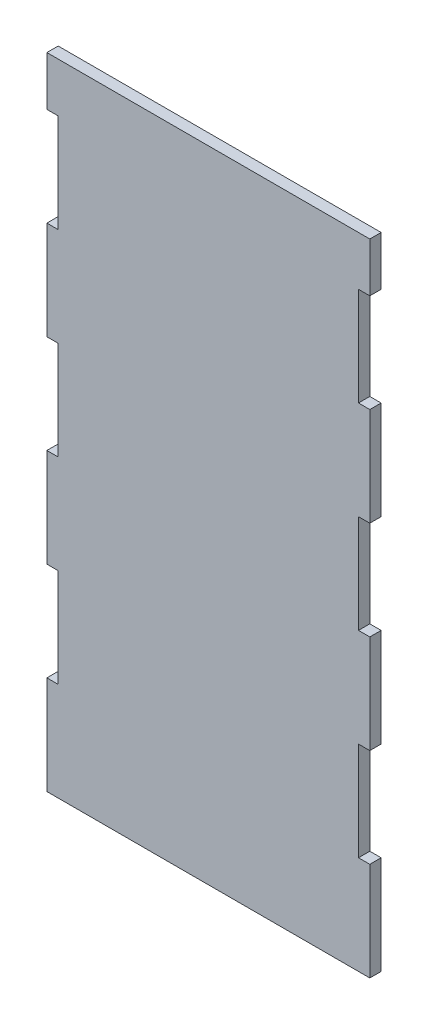
ISO-10303-21;
HEADER;
FILE_DESCRIPTION(('STEP AP214'),'2;1');
FILE_NAME('part.step','',(''),(''),'','','');
FILE_SCHEMA(('AUTOMOTIVE_DESIGN { 1 0 10303 214 1 1 1 1 }'));
ENDSEC;
DATA;
#1=APPLICATION_CONTEXT('core data for automotive mechanical design processes');
#2=APPLICATION_PROTOCOL_DEFINITION('international standard','automotive_design',2000,#1);
#3=PRODUCT_CONTEXT('',#1,'mechanical');
#4=PRODUCT('Part','Part','',(#3));
#5=PRODUCT_RELATED_PRODUCT_CATEGORY('part','',(#4));
#6=PRODUCT_DEFINITION_FORMATION('','',#4);
#7=PRODUCT_DEFINITION_CONTEXT('part definition',#1,'design');
#8=PRODUCT_DEFINITION('design','',#6,#7);
#9=PRODUCT_DEFINITION_SHAPE('','',#8);
#10=(LENGTH_UNIT() NAMED_UNIT(*) SI_UNIT(.MILLI.,.METRE.));
#11=(NAMED_UNIT(*) PLANE_ANGLE_UNIT() SI_UNIT($,.RADIAN.));
#12=(NAMED_UNIT(*) SI_UNIT($,.STERADIAN.) SOLID_ANGLE_UNIT());
#13=UNCERTAINTY_MEASURE_WITH_UNIT(LENGTH_MEASURE(1.E-05),#10,'distance_accuracy_value','');
#14=(GEOMETRIC_REPRESENTATION_CONTEXT(3) GLOBAL_UNCERTAINTY_ASSIGNED_CONTEXT((#13)) GLOBAL_UNIT_ASSIGNED_CONTEXT((#10,
#11,#12)) REPRESENTATION_CONTEXT('',''));
#15=CARTESIAN_POINT('',(0.,0.,0.));
#16=DIRECTION('',(0.,0.,1.));
#17=DIRECTION('',(1.,0.,0.));
#18=AXIS2_PLACEMENT_3D('',#15,#16,#17);
#19=CARTESIAN_POINT('',(-41.656,82.55,1.4605));
#20=DIRECTION('',(1.,0.,0.));
#21=DIRECTION('',(0.,1.,0.));
#22=AXIS2_PLACEMENT_3D('',#19,#20,#21);
#23=PLANE('',#22);
#24=DIRECTION('',(0.,0.,1.));
#25=VECTOR('',#24,1.);
#26=CARTESIAN_POINT('',(-41.656,-31.75,-1.4605));
#27=LINE('',#26,#25);
#28=CARTESIAN_POINT('',(-41.656,-31.75,-1.4605));
#29=VERTEX_POINT('',#28);
#30=CARTESIAN_POINT('',(-41.656,-31.75,1.4605));
#31=VERTEX_POINT('',#30);
#32=EDGE_CURVE('E563',#29,#31,#27,.T.);
#33=ORIENTED_EDGE('',*,*,#32,.T.);
#34=DIRECTION('',(0.,-1.,0.));
#35=VECTOR('',#34,1.);
#36=CARTESIAN_POINT('',(-41.656,82.55,1.4605));
#37=LINE('',#36,#35);
#38=CARTESIAN_POINT('',(-41.656,-6.35,1.4605));
#39=VERTEX_POINT('',#38);
#40=EDGE_CURVE('E515',#39,#31,#37,.T.);
#41=ORIENTED_EDGE('',*,*,#40,.F.);
#42=DIRECTION('',(0.,0.,1.));
#43=VECTOR('',#42,1.);
#44=CARTESIAN_POINT('',(-41.656,-6.35,-1.4605));
#45=LINE('',#44,#43);
#46=CARTESIAN_POINT('',(-41.656,-6.35,-1.4605));
#47=VERTEX_POINT('',#46);
#48=EDGE_CURVE('E245',#47,#39,#45,.T.);
#49=ORIENTED_EDGE('',*,*,#48,.F.);
#50=DIRECTION('',(0.,-1.,0.));
#51=VECTOR('',#50,1.);
#52=CARTESIAN_POINT('',(-41.656,82.55,-1.4605));
#53=LINE('',#52,#51);
#54=EDGE_CURVE('E266',#47,#29,#53,.T.);
#55=ORIENTED_EDGE('',*,*,#54,.T.);
#56=EDGE_LOOP('',(#33,#41,#49,#55));
#57=FACE_BOUND('',#56,.T.);
#58=ADVANCED_FACE('F47',(#57),#23,.F.);
#59=DIRECTION('',(0.,0.,1.));
#60=VECTOR('',#59,1.);
#61=CARTESIAN_POINT('',(-41.656,19.05,-1.4605));
#62=LINE('',#61,#60);
#63=CARTESIAN_POINT('',(-41.656,19.05,-1.4605));
#64=VERTEX_POINT('',#63);
#65=CARTESIAN_POINT('',(-41.656,19.05,1.4605));
#66=VERTEX_POINT('',#65);
#67=EDGE_CURVE('E232',#64,#66,#62,.T.);
#68=ORIENTED_EDGE('',*,*,#67,.T.);
#69=CARTESIAN_POINT('',(-41.656,44.45,1.4605));
#70=VERTEX_POINT('',#69);
#71=EDGE_CURVE('E457',#70,#66,#37,.T.);
#72=ORIENTED_EDGE('',*,*,#71,.F.);
#73=DIRECTION('',(0.,0.,1.));
#74=VECTOR('',#73,1.);
#75=CARTESIAN_POINT('',(-41.656,44.45,-1.4605));
#76=LINE('',#75,#74);
#77=CARTESIAN_POINT('',(-41.656,44.45,-1.4605));
#78=VERTEX_POINT('',#77);
#79=EDGE_CURVE('E263',#78,#70,#76,.T.);
#80=ORIENTED_EDGE('',*,*,#79,.F.);
#81=EDGE_CURVE('E254',#78,#64,#53,.T.);
#82=ORIENTED_EDGE('',*,*,#81,.T.);
#83=EDGE_LOOP('',(#68,#72,#80,#82));
#84=FACE_BOUND('',#83,.T.);
#85=ADVANCED_FACE('F262',(#84),#23,.F.);
#86=DIRECTION('',(0.,0.,1.));
#87=VECTOR('',#86,1.);
#88=CARTESIAN_POINT('',(-41.656,69.85,-1.4605));
#89=LINE('',#88,#87);
#90=CARTESIAN_POINT('',(-41.656,69.85,-1.4605));
#91=VERTEX_POINT('',#90);
#92=CARTESIAN_POINT('',(-41.656,69.85,1.4605));
#93=VERTEX_POINT('',#92);
#94=EDGE_CURVE('E427',#91,#93,#89,.T.);
#95=ORIENTED_EDGE('',*,*,#94,.T.);
#96=CARTESIAN_POINT('',(-41.656,82.55,1.4605));
#97=VERTEX_POINT('',#96);
#98=EDGE_CURVE('E452',#97,#93,#37,.T.);
#99=ORIENTED_EDGE('',*,*,#98,.F.);
#100=DIRECTION('',(0.,0.,-1.));
#101=VECTOR('',#100,1.);
#102=CARTESIAN_POINT('',(-41.656,82.55,1.4605));
#103=LINE('',#102,#101);
#104=CARTESIAN_POINT('',(-41.656,82.55,-1.4605));
#105=VERTEX_POINT('',#104);
#106=EDGE_CURVE('E290',#97,#105,#103,.T.);
#107=ORIENTED_EDGE('',*,*,#106,.T.);
#108=EDGE_CURVE('E265',#105,#91,#53,.T.);
#109=ORIENTED_EDGE('',*,*,#108,.T.);
#110=EDGE_LOOP('',(#95,#99,#107,#109));
#111=FACE_BOUND('',#110,.T.);
#112=ADVANCED_FACE('F503',(#111),#23,.F.);
#113=CARTESIAN_POINT('',(41.656,82.55,1.4605));
#114=DIRECTION('',(-1.,0.,0.));
#115=DIRECTION('',(0.,0.,1.));
#116=AXIS2_PLACEMENT_3D('',#113,#114,#115);
#117=PLANE('',#116);
#118=DIRECTION('',(0.,0.,1.));
#119=VECTOR('',#118,1.);
#120=CARTESIAN_POINT('',(41.656,69.85,-1.4605));
#121=LINE('',#120,#119);
#122=CARTESIAN_POINT('',(41.656,69.85,-1.4605));
#123=VERTEX_POINT('',#122);
#124=CARTESIAN_POINT('',(41.656,69.85,1.4605));
#125=VERTEX_POINT('',#124);
#126=EDGE_CURVE('E367',#123,#125,#121,.T.);
#127=ORIENTED_EDGE('',*,*,#126,.F.);
#128=DIRECTION('',(0.,1.,0.));
#129=VECTOR('',#128,1.);
#130=CARTESIAN_POINT('',(41.656,82.55,-1.4605));
#131=LINE('',#130,#129);
#132=CARTESIAN_POINT('',(41.656,82.55,-1.4605));
#133=VERTEX_POINT('',#132);
#134=EDGE_CURVE('E280',#123,#133,#131,.T.);
#135=ORIENTED_EDGE('',*,*,#134,.T.);
#136=DIRECTION('',(0.,0.,-1.));
#137=VECTOR('',#136,1.);
#138=CARTESIAN_POINT('',(41.656,82.55,1.4605));
#139=LINE('',#138,#137);
#140=CARTESIAN_POINT('',(41.656,82.55,1.4605));
#141=VERTEX_POINT('',#140);
#142=EDGE_CURVE('E294',#141,#133,#139,.T.);
#143=ORIENTED_EDGE('',*,*,#142,.F.);
#144=DIRECTION('',(0.,1.,0.));
#145=VECTOR('',#144,1.);
#146=CARTESIAN_POINT('',(41.656,82.55,1.4605));
#147=LINE('',#146,#145);
#148=EDGE_CURVE('E459',#125,#141,#147,.T.);
#149=ORIENTED_EDGE('',*,*,#148,.F.);
#150=EDGE_LOOP('',(#127,#135,#143,#149));
#151=FACE_BOUND('',#150,.T.);
#152=ADVANCED_FACE('F495',(#151),#117,.F.);
#153=CARTESIAN_POINT('',(41.656,19.05,-1.4605));
#154=VERTEX_POINT('',#153);
#155=CARTESIAN_POINT('',(41.656,44.45,-1.4605));
#156=VERTEX_POINT('',#155);
#157=EDGE_CURVE('E484',#154,#156,#131,.T.);
#158=ORIENTED_EDGE('',*,*,#157,.T.);
#159=DIRECTION('',(0.,0.,1.));
#160=VECTOR('',#159,1.);
#161=CARTESIAN_POINT('',(41.656,44.45,-1.4605));
#162=LINE('',#161,#160);
#163=CARTESIAN_POINT('',(41.656,44.45,1.4605));
#164=VERTEX_POINT('',#163);
#165=EDGE_CURVE('E407',#156,#164,#162,.T.);
#166=ORIENTED_EDGE('',*,*,#165,.T.);
#167=CARTESIAN_POINT('',(41.656,19.05,1.4605));
#168=VERTEX_POINT('',#167);
#169=EDGE_CURVE('E467',#168,#164,#147,.T.);
#170=ORIENTED_EDGE('',*,*,#169,.F.);
#171=DIRECTION('',(0.,0.,1.));
#172=VECTOR('',#171,1.);
#173=CARTESIAN_POINT('',(41.656,19.05,-1.4605));
#174=LINE('',#173,#172);
#175=EDGE_CURVE('E335',#154,#168,#174,.T.);
#176=ORIENTED_EDGE('',*,*,#175,.F.);
#177=EDGE_LOOP('',(#158,#166,#170,#176));
#178=FACE_BOUND('',#177,.T.);
#179=ADVANCED_FACE('F482',(#178),#117,.F.);
#180=CARTESIAN_POINT('',(41.656,-31.75,-1.4605));
#181=VERTEX_POINT('',#180);
#182=CARTESIAN_POINT('',(41.656,-6.35000000000001,-1.4605));
#183=VERTEX_POINT('',#182);
#184=EDGE_CURVE('E286',#181,#183,#131,.T.);
#185=ORIENTED_EDGE('',*,*,#184,.T.);
#186=DIRECTION('',(0.,0.,1.));
#187=VECTOR('',#186,1.);
#188=CARTESIAN_POINT('',(41.656,-6.35000000000001,-1.4605));
#189=LINE('',#188,#187);
#190=CARTESIAN_POINT('',(41.656,-6.35000000000001,1.4605));
#191=VERTEX_POINT('',#190);
#192=EDGE_CURVE('E375',#183,#191,#189,.T.);
#193=ORIENTED_EDGE('',*,*,#192,.T.);
#194=CARTESIAN_POINT('',(41.656,-31.75,1.4605));
#195=VERTEX_POINT('',#194);
#196=EDGE_CURVE('E461',#195,#191,#147,.T.);
#197=ORIENTED_EDGE('',*,*,#196,.F.);
#198=DIRECTION('',(0.,0.,1.));
#199=VECTOR('',#198,1.);
#200=CARTESIAN_POINT('',(41.656,-31.75,-1.4605));
#201=LINE('',#200,#199);
#202=EDGE_CURVE('E342',#181,#195,#201,.T.);
#203=ORIENTED_EDGE('',*,*,#202,.F.);
#204=EDGE_LOOP('',(#185,#193,#197,#203));
#205=FACE_BOUND('',#204,.T.);
#206=ADVANCED_FACE('F593',(#205),#117,.F.);
#207=CARTESIAN_POINT('',(0.,0.,1.4605));
#208=DIRECTION('',(0.,0.,1.));
#209=DIRECTION('',(1.,0.,0.));
#210=AXIS2_PLACEMENT_3D('',#207,#208,#209);
#211=PLANE('',#210);
#212=DIRECTION('',(0.,-1.,0.));
#213=VECTOR('',#212,1.);
#214=CARTESIAN_POINT('',(38.735,0.,1.4605));
#215=LINE('',#214,#213);
#216=CARTESIAN_POINT('',(38.735,69.85,1.4605));
#217=VERTEX_POINT('',#216);
#218=CARTESIAN_POINT('',(38.735,44.45,1.4605));
#219=VERTEX_POINT('',#218);
#220=EDGE_CURVE('E399',#217,#219,#215,.T.);
#221=ORIENTED_EDGE('',*,*,#220,.F.);
#222=DIRECTION('',(1.,0.,0.));
#223=VECTOR('',#222,1.);
#224=CARTESIAN_POINT('',(0.,69.85,1.4605));
#225=LINE('',#224,#223);
#226=EDGE_CURVE('E395',#217,#125,#225,.T.);
#227=ORIENTED_EDGE('',*,*,#226,.T.);
#228=ORIENTED_EDGE('',*,*,#148,.T.);
#229=DIRECTION('',(-1.,0.,0.));
#230=VECTOR('',#229,1.);
#231=CARTESIAN_POINT('',(-41.656,82.55,1.4605));
#232=LINE('',#231,#230);
#233=EDGE_CURVE('E276',#141,#97,#232,.T.);
#234=ORIENTED_EDGE('',*,*,#233,.T.);
#235=ORIENTED_EDGE('',*,*,#98,.T.);
#236=DIRECTION('',(1.,0.,0.));
#237=VECTOR('',#236,1.);
#238=CARTESIAN_POINT('',(3.31860143230342E-13,69.8499999999998,1.4605));
#239=LINE('',#238,#237);
#240=CARTESIAN_POINT('',(-38.735,69.85,1.4605));
#241=VERTEX_POINT('',#240);
#242=EDGE_CURVE('E428',#93,#241,#239,.T.);
#243=ORIENTED_EDGE('',*,*,#242,.T.);
#244=DIRECTION('',(0.,-1.,0.));
#245=VECTOR('',#244,1.);
#246=CARTESIAN_POINT('',(-38.735,0.,1.4605));
#247=LINE('',#246,#245);
#248=CARTESIAN_POINT('',(-38.735,44.45,1.4605));
#249=VERTEX_POINT('',#248);
#250=EDGE_CURVE('E420',#241,#249,#247,.T.);
#251=ORIENTED_EDGE('',*,*,#250,.T.);
#252=DIRECTION('',(1.,0.,0.));
#253=VECTOR('',#252,1.);
#254=CARTESIAN_POINT('',(2.11183727510218E-13,44.4499999999998,1.4605));
#255=LINE('',#254,#253);
#256=EDGE_CURVE('E432',#70,#249,#255,.T.);
#257=ORIENTED_EDGE('',*,*,#256,.F.);
#258=ORIENTED_EDGE('',*,*,#71,.T.);
#259=DIRECTION('',(1.,0.,0.));
#260=VECTOR('',#259,1.);
#261=CARTESIAN_POINT('',(0.,19.0499999999998,1.4605));
#262=LINE('',#261,#260);
#263=CARTESIAN_POINT('',(-38.735,19.05,1.4605));
#264=VERTEX_POINT('',#263);
#265=EDGE_CURVE('E239',#66,#264,#262,.T.);
#266=ORIENTED_EDGE('',*,*,#265,.T.);
#267=DIRECTION('',(0.,-1.,0.));
#268=VECTOR('',#267,1.);
#269=CARTESIAN_POINT('',(-38.735,0.,1.4605));
#270=LINE('',#269,#268);
#271=CARTESIAN_POINT('',(-38.735,-6.35,1.4605));
#272=VERTEX_POINT('',#271);
#273=EDGE_CURVE('E259',#264,#272,#270,.T.);
#274=ORIENTED_EDGE('',*,*,#273,.T.);
#275=DIRECTION('',(1.,0.,0.));
#276=VECTOR('',#275,1.);
#277=CARTESIAN_POINT('',(0.,-6.35000000000019,1.4605));
#278=LINE('',#277,#276);
#279=EDGE_CURVE('E548',#39,#272,#278,.T.);
#280=ORIENTED_EDGE('',*,*,#279,.F.);
#281=ORIENTED_EDGE('',*,*,#40,.T.);
#282=DIRECTION('',(1.,0.,0.));
#283=VECTOR('',#282,1.);
#284=CARTESIAN_POINT('',(-1.50845519650157E-13,-31.7500000000002,1.4605));
#285=LINE('',#284,#283);
#286=CARTESIAN_POINT('',(-38.735,-31.75,1.4605));
#287=VERTEX_POINT('',#286);
#288=EDGE_CURVE('E345',#31,#287,#285,.T.);
#289=ORIENTED_EDGE('',*,*,#288,.T.);
#290=DIRECTION('',(0.,-1.,0.));
#291=VECTOR('',#290,1.);
#292=CARTESIAN_POINT('',(-38.735,0.,1.4605));
#293=LINE('',#292,#291);
#294=CARTESIAN_POINT('',(-38.735,-57.15,1.4605));
#295=VERTEX_POINT('',#294);
#296=EDGE_CURVE('E577',#287,#295,#293,.T.);
#297=ORIENTED_EDGE('',*,*,#296,.T.);
#298=DIRECTION('',(1.,0.,0.));
#299=VECTOR('',#298,1.);
#300=CARTESIAN_POINT('',(-1.35760967685141E-13,-57.1500000000001,1.4605));
#301=LINE('',#300,#299);
#302=CARTESIAN_POINT('',(-41.656,-57.15,1.4605));
#303=VERTEX_POINT('',#302);
#304=EDGE_CURVE('E526',#303,#295,#301,.T.);
#305=ORIENTED_EDGE('',*,*,#304,.F.);
#306=CARTESIAN_POINT('',(-41.656,-82.55,1.4605));
#307=VERTEX_POINT('',#306);
#308=EDGE_CURVE('E289',#303,#307,#37,.T.);
#309=ORIENTED_EDGE('',*,*,#308,.T.);
#310=DIRECTION('',(1.,0.,0.));
#311=VECTOR('',#310,1.);
#312=CARTESIAN_POINT('',(-41.656,-82.55,1.4605));
#313=LINE('',#312,#311);
#314=CARTESIAN_POINT('',(41.656,-82.55,1.4605));
#315=VERTEX_POINT('',#314);
#316=EDGE_CURVE('E456',#307,#315,#313,.T.);
#317=ORIENTED_EDGE('',*,*,#316,.T.);
#318=CARTESIAN_POINT('',(41.656,-57.15,1.4605));
#319=VERTEX_POINT('',#318);
#320=EDGE_CURVE('E306',#315,#319,#147,.T.);
#321=ORIENTED_EDGE('',*,*,#320,.T.);
#322=DIRECTION('',(1.,0.,0.));
#323=VECTOR('',#322,1.);
#324=CARTESIAN_POINT('',(0.,-57.15,1.4605));
#325=LINE('',#324,#323);
#326=CARTESIAN_POINT('',(38.735,-57.15,1.4605));
#327=VERTEX_POINT('',#326);
#328=EDGE_CURVE('E339',#327,#319,#325,.T.);
#329=ORIENTED_EDGE('',*,*,#328,.F.);
#330=DIRECTION('',(0.,-1.,0.));
#331=VECTOR('',#330,1.);
#332=CARTESIAN_POINT('',(38.735,0.,1.4605));
#333=LINE('',#332,#331);
#334=CARTESIAN_POINT('',(38.735,-31.75,1.4605));
#335=VERTEX_POINT('',#334);
#336=EDGE_CURVE('E334',#335,#327,#333,.T.);
#337=ORIENTED_EDGE('',*,*,#336,.F.);
#338=DIRECTION('',(1.,0.,0.));
#339=VECTOR('',#338,1.);
#340=CARTESIAN_POINT('',(0.,-31.75,1.4605));
#341=LINE('',#340,#339);
#342=EDGE_CURVE('E330',#335,#195,#341,.T.);
#343=ORIENTED_EDGE('',*,*,#342,.T.);
#344=ORIENTED_EDGE('',*,*,#196,.T.);
#345=DIRECTION('',(1.,0.,0.));
#346=VECTOR('',#345,1.);
#347=CARTESIAN_POINT('',(0.,-6.35000000000001,1.4605));
#348=LINE('',#347,#346);
#349=CARTESIAN_POINT('',(38.735,-6.35000000000001,1.4605));
#350=VERTEX_POINT('',#349);
#351=EDGE_CURVE('E355',#350,#191,#348,.T.);
#352=ORIENTED_EDGE('',*,*,#351,.F.);
#353=DIRECTION('',(0.,-1.,0.));
#354=VECTOR('',#353,1.);
#355=CARTESIAN_POINT('',(38.735,0.,1.4605));
#356=LINE('',#355,#354);
#357=CARTESIAN_POINT('',(38.735,19.05,1.4605));
#358=VERTEX_POINT('',#357);
#359=EDGE_CURVE('E366',#358,#350,#356,.T.);
#360=ORIENTED_EDGE('',*,*,#359,.F.);
#361=DIRECTION('',(1.,0.,0.));
#362=VECTOR('',#361,1.);
#363=CARTESIAN_POINT('',(0.,19.05,1.4605));
#364=LINE('',#363,#362);
#365=EDGE_CURVE('E362',#358,#168,#364,.T.);
#366=ORIENTED_EDGE('',*,*,#365,.T.);
#367=ORIENTED_EDGE('',*,*,#169,.T.);
#368=DIRECTION('',(1.,0.,0.));
#369=VECTOR('',#368,1.);
#370=CARTESIAN_POINT('',(0.,44.45,1.4605));
#371=LINE('',#370,#369);
#372=EDGE_CURVE('E388',#219,#164,#371,.T.);
#373=ORIENTED_EDGE('',*,*,#372,.F.);
#374=EDGE_LOOP('',(#221,#227,#228,#234,#235,#243,#251,#257,#258,#266,#274,#280,#281,#289,#297,
#305,#309,#317,#321,#329,#337,#343,#344,#352,#360,#366,#367,#373));
#375=FACE_BOUND('',#374,.T.);
#376=ADVANCED_FACE('F476',(#375),#211,.T.);
#377=CARTESIAN_POINT('',(0.,0.,-1.4605));
#378=DIRECTION('',(0.,0.,1.));
#379=DIRECTION('',(1.,0.,0.));
#380=AXIS2_PLACEMENT_3D('',#377,#378,#379);
#381=PLANE('',#380);
#382=DIRECTION('',(1.,0.,0.));
#383=VECTOR('',#382,1.);
#384=CARTESIAN_POINT('',(0.,69.85,-1.4605));
#385=LINE('',#384,#383);
#386=CARTESIAN_POINT('',(38.735,69.85,-1.4605));
#387=VERTEX_POINT('',#386);
#388=EDGE_CURVE('E384',#387,#123,#385,.T.);
#389=ORIENTED_EDGE('',*,*,#388,.F.);
#390=DIRECTION('',(0.,-1.,0.));
#391=VECTOR('',#390,1.);
#392=CARTESIAN_POINT('',(38.735,0.,-1.4605));
#393=LINE('',#392,#391);
#394=CARTESIAN_POINT('',(38.735,44.45,-1.4605));
#395=VERTEX_POINT('',#394);
#396=EDGE_CURVE('E387',#387,#395,#393,.T.);
#397=ORIENTED_EDGE('',*,*,#396,.T.);
#398=DIRECTION('',(1.,0.,0.));
#399=VECTOR('',#398,1.);
#400=CARTESIAN_POINT('',(0.,44.45,-1.4605));
#401=LINE('',#400,#399);
#402=EDGE_CURVE('E63',#395,#156,#401,.T.);
#403=ORIENTED_EDGE('',*,*,#402,.T.);
#404=ORIENTED_EDGE('',*,*,#157,.F.);
#405=DIRECTION('',(1.,0.,0.));
#406=VECTOR('',#405,1.);
#407=CARTESIAN_POINT('',(0.,19.05,-1.4605));
#408=LINE('',#407,#406);
#409=CARTESIAN_POINT('',(38.735,19.05,-1.4605));
#410=VERTEX_POINT('',#409);
#411=EDGE_CURVE('E351',#410,#154,#408,.T.);
#412=ORIENTED_EDGE('',*,*,#411,.F.);
#413=DIRECTION('',(0.,-1.,0.));
#414=VECTOR('',#413,1.);
#415=CARTESIAN_POINT('',(38.735,0.,-1.4605));
#416=LINE('',#415,#414);
#417=CARTESIAN_POINT('',(38.735,-6.35000000000001,-1.4605));
#418=VERTEX_POINT('',#417);
#419=EDGE_CURVE('E354',#410,#418,#416,.T.);
#420=ORIENTED_EDGE('',*,*,#419,.T.);
#421=DIRECTION('',(1.,0.,0.));
#422=VECTOR('',#421,1.);
#423=CARTESIAN_POINT('',(0.,-6.35000000000001,-1.4605));
#424=LINE('',#423,#422);
#425=EDGE_CURVE('E71',#418,#183,#424,.T.);
#426=ORIENTED_EDGE('',*,*,#425,.T.);
#427=ORIENTED_EDGE('',*,*,#184,.F.);
#428=DIRECTION('',(1.,0.,0.));
#429=VECTOR('',#428,1.);
#430=CARTESIAN_POINT('',(0.,-31.75,-1.4605));
#431=LINE('',#430,#429);
#432=CARTESIAN_POINT('',(38.735,-31.75,-1.4605));
#433=VERTEX_POINT('',#432);
#434=EDGE_CURVE('E326',#433,#181,#431,.T.);
#435=ORIENTED_EDGE('',*,*,#434,.F.);
#436=DIRECTION('',(0.,-1.,0.));
#437=VECTOR('',#436,1.);
#438=CARTESIAN_POINT('',(38.735,0.,-1.4605));
#439=LINE('',#438,#437);
#440=CARTESIAN_POINT('',(38.735,-57.15,-1.4605));
#441=VERTEX_POINT('',#440);
#442=EDGE_CURVE('E316',#433,#441,#439,.T.);
#443=ORIENTED_EDGE('',*,*,#442,.T.);
#444=DIRECTION('',(1.,0.,0.));
#445=VECTOR('',#444,1.);
#446=CARTESIAN_POINT('',(0.,-57.15,-1.4605));
#447=LINE('',#446,#445);
#448=CARTESIAN_POINT('',(41.656,-57.15,-1.4605));
#449=VERTEX_POINT('',#448);
#450=EDGE_CURVE('E313',#441,#449,#447,.T.);
#451=ORIENTED_EDGE('',*,*,#450,.T.);
#452=CARTESIAN_POINT('',(41.656,-82.55,-1.4605));
#453=VERTEX_POINT('',#452);
#454=EDGE_CURVE('E281',#453,#449,#131,.T.);
#455=ORIENTED_EDGE('',*,*,#454,.F.);
#456=DIRECTION('',(1.,0.,0.));
#457=VECTOR('',#456,1.);
#458=CARTESIAN_POINT('',(-41.656,-82.55,-1.4605));
#459=LINE('',#458,#457);
#460=CARTESIAN_POINT('',(-41.656,-82.55,-1.4605));
#461=VERTEX_POINT('',#460);
#462=EDGE_CURVE('E271',#461,#453,#459,.T.);
#463=ORIENTED_EDGE('',*,*,#462,.F.);
#464=CARTESIAN_POINT('',(-41.656,-57.15,-1.4605));
#465=VERTEX_POINT('',#464);
#466=EDGE_CURVE('E272',#465,#461,#53,.T.);
#467=ORIENTED_EDGE('',*,*,#466,.F.);
#468=DIRECTION('',(1.,0.,0.));
#469=VECTOR('',#468,1.);
#470=CARTESIAN_POINT('',(-1.35760967685141E-13,-57.1500000000001,-1.4605));
#471=LINE('',#470,#469);
#472=CARTESIAN_POINT('',(-38.735,-57.15,-1.4605));
#473=VERTEX_POINT('',#472);
#474=EDGE_CURVE('E571',#465,#473,#471,.T.);
#475=ORIENTED_EDGE('',*,*,#474,.T.);
#476=DIRECTION('',(0.,-1.,0.));
#477=VECTOR('',#476,1.);
#478=CARTESIAN_POINT('',(-38.735,0.,-1.4605));
#479=LINE('',#478,#477);
#480=CARTESIAN_POINT('',(-38.735,-31.75,-1.4605));
#481=VERTEX_POINT('',#480);
#482=EDGE_CURVE('E567',#481,#473,#479,.T.);
#483=ORIENTED_EDGE('',*,*,#482,.F.);
#484=DIRECTION('',(1.,0.,0.));
#485=VECTOR('',#484,1.);
#486=CARTESIAN_POINT('',(-1.50845519650157E-13,-31.7500000000002,-1.4605));
#487=LINE('',#486,#485);
#488=EDGE_CURVE('E574',#29,#481,#487,.T.);
#489=ORIENTED_EDGE('',*,*,#488,.F.);
#490=ORIENTED_EDGE('',*,*,#54,.F.);
#491=DIRECTION('',(1.,0.,0.));
#492=VECTOR('',#491,1.);
#493=CARTESIAN_POINT('',(0.,-6.35000000000019,-1.4605));
#494=LINE('',#493,#492);
#495=CARTESIAN_POINT('',(-38.735,-6.35000000000001,-1.4605));
#496=VERTEX_POINT('',#495);
#497=EDGE_CURVE('E258',#47,#496,#494,.T.);
#498=ORIENTED_EDGE('',*,*,#497,.T.);
#499=DIRECTION('',(0.,-1.,0.));
#500=VECTOR('',#499,1.);
#501=CARTESIAN_POINT('',(-38.735,0.,-1.4605));
#502=LINE('',#501,#500);
#503=CARTESIAN_POINT('',(-38.735,19.05,-1.4605));
#504=VERTEX_POINT('',#503);
#505=EDGE_CURVE('E246',#504,#496,#502,.T.);
#506=ORIENTED_EDGE('',*,*,#505,.F.);
#507=DIRECTION('',(1.,0.,0.));
#508=VECTOR('',#507,1.);
#509=CARTESIAN_POINT('',(0.,19.0499999999998,-1.4605));
#510=LINE('',#509,#508);
#511=EDGE_CURVE('E236',#64,#504,#510,.T.);
#512=ORIENTED_EDGE('',*,*,#511,.F.);
#513=ORIENTED_EDGE('',*,*,#81,.F.);
#514=DIRECTION('',(1.,0.,0.));
#515=VECTOR('',#514,1.);
#516=CARTESIAN_POINT('',(2.11183727510218E-13,44.4499999999998,-1.4605));
#517=LINE('',#516,#515);
#518=CARTESIAN_POINT('',(-38.735,44.45,-1.4605));
#519=VERTEX_POINT('',#518);
#520=EDGE_CURVE('E419',#78,#519,#517,.T.);
#521=ORIENTED_EDGE('',*,*,#520,.T.);
#522=DIRECTION('',(0.,-1.,0.));
#523=VECTOR('',#522,1.);
#524=CARTESIAN_POINT('',(-38.735,0.,-1.4605));
#525=LINE('',#524,#523);
#526=CARTESIAN_POINT('',(-38.735,69.85,-1.4605));
#527=VERTEX_POINT('',#526);
#528=EDGE_CURVE('E423',#527,#519,#525,.T.);
#529=ORIENTED_EDGE('',*,*,#528,.F.);
#530=DIRECTION('',(1.,0.,0.));
#531=VECTOR('',#530,1.);
#532=CARTESIAN_POINT('',(3.31860143230342E-13,69.8499999999998,-1.4605));
#533=LINE('',#532,#531);
#534=EDGE_CURVE('E416',#91,#527,#533,.T.);
#535=ORIENTED_EDGE('',*,*,#534,.F.);
#536=ORIENTED_EDGE('',*,*,#108,.F.);
#537=DIRECTION('',(-1.,0.,0.));
#538=VECTOR('',#537,1.);
#539=CARTESIAN_POINT('',(-41.656,82.55,-1.4605));
#540=LINE('',#539,#538);
#541=EDGE_CURVE('E285',#133,#105,#540,.T.);
#542=ORIENTED_EDGE('',*,*,#541,.F.);
#543=ORIENTED_EDGE('',*,*,#134,.F.);
#544=EDGE_LOOP('',(#389,#397,#403,#404,#412,#420,#426,#427,#435,#443,#451,#455,#463,#467,#475,
#483,#489,#490,#498,#506,#512,#513,#521,#529,#535,#536,#542,#543));
#545=FACE_BOUND('',#544,.T.);
#546=ADVANCED_FACE('F252',(#545),#381,.F.);
#547=ORIENTED_EDGE('',*,*,#308,.F.);
#548=DIRECTION('',(0.,0.,1.));
#549=VECTOR('',#548,1.);
#550=CARTESIAN_POINT('',(-41.656,-57.15,-1.4605));
#551=LINE('',#550,#549);
#552=EDGE_CURVE('E531',#465,#303,#551,.T.);
#553=ORIENTED_EDGE('',*,*,#552,.F.);
#554=ORIENTED_EDGE('',*,*,#466,.T.);
#555=DIRECTION('',(0.,0.,-1.));
#556=VECTOR('',#555,1.);
#557=CARTESIAN_POINT('',(-41.656,-82.55,1.4605));
#558=LINE('',#557,#556);
#559=EDGE_CURVE('E11',#307,#461,#558,.T.);
#560=ORIENTED_EDGE('',*,*,#559,.F.);
#561=EDGE_LOOP('',(#547,#553,#554,#560));
#562=FACE_BOUND('',#561,.T.);
#563=ADVANCED_FACE('F49',(#562),#23,.F.);
#564=CARTESIAN_POINT('',(-41.656,-82.55,1.4605));
#565=DIRECTION('',(0.,1.,0.));
#566=DIRECTION('',(0.,0.,1.));
#567=AXIS2_PLACEMENT_3D('',#564,#565,#566);
#568=PLANE('',#567);
#569=ORIENTED_EDGE('',*,*,#462,.T.);
#570=DIRECTION('',(0.,0.,-1.));
#571=VECTOR('',#570,1.);
#572=CARTESIAN_POINT('',(41.656,-82.55,1.4605));
#573=LINE('',#572,#571);
#574=EDGE_CURVE('E56',#315,#453,#573,.T.);
#575=ORIENTED_EDGE('',*,*,#574,.F.);
#576=ORIENTED_EDGE('',*,*,#316,.F.);
#577=ORIENTED_EDGE('',*,*,#559,.T.);
#578=EDGE_LOOP('',(#569,#575,#576,#577));
#579=FACE_BOUND('',#578,.T.);
#580=ADVANCED_FACE('F530',(#579),#568,.F.);
#581=ORIENTED_EDGE('',*,*,#454,.T.);
#582=DIRECTION('',(0.,0.,1.));
#583=VECTOR('',#582,1.);
#584=CARTESIAN_POINT('',(41.656,-57.15,-1.4605));
#585=LINE('',#584,#583);
#586=EDGE_CURVE('E346',#449,#319,#585,.T.);
#587=ORIENTED_EDGE('',*,*,#586,.T.);
#588=ORIENTED_EDGE('',*,*,#320,.F.);
#589=ORIENTED_EDGE('',*,*,#574,.T.);
#590=EDGE_LOOP('',(#581,#587,#588,#589));
#591=FACE_BOUND('',#590,.T.);
#592=ADVANCED_FACE('F303',(#591),#117,.F.);
#593=CARTESIAN_POINT('',(-41.656,82.55,1.4605));
#594=DIRECTION('',(0.,-1.,0.));
#595=DIRECTION('',(0.,0.,-1.));
#596=AXIS2_PLACEMENT_3D('',#593,#594,#595);
#597=PLANE('',#596);
#598=ORIENTED_EDGE('',*,*,#541,.T.);
#599=ORIENTED_EDGE('',*,*,#106,.F.);
#600=ORIENTED_EDGE('',*,*,#233,.F.);
#601=ORIENTED_EDGE('',*,*,#142,.T.);
#602=EDGE_LOOP('',(#598,#599,#600,#601));
#603=FACE_BOUND('',#602,.T.);
#604=ADVANCED_FACE('F500',(#603),#597,.F.);
#605=CARTESIAN_POINT('',(3.31860143230342E-13,69.8499999999998,-1.4605));
#606=DIRECTION('',(0.,-1.,0.));
#607=DIRECTION('',(1.,0.,0.));
#608=AXIS2_PLACEMENT_3D('',#605,#606,#607);
#609=PLANE('',#608);
#610=ORIENTED_EDGE('',*,*,#242,.F.);
#611=ORIENTED_EDGE('',*,*,#94,.F.);
#612=ORIENTED_EDGE('',*,*,#534,.T.);
#613=DIRECTION('',(0.,0.,1.));
#614=VECTOR('',#613,1.);
#615=CARTESIAN_POINT('',(-38.735,69.85,-1.4605));
#616=LINE('',#615,#614);
#617=EDGE_CURVE('E440',#527,#241,#616,.T.);
#618=ORIENTED_EDGE('',*,*,#617,.T.);
#619=EDGE_LOOP('',(#610,#611,#612,#618));
#620=FACE_BOUND('',#619,.T.);
#621=ADVANCED_FACE('F507',(#620),#609,.T.);
#622=CARTESIAN_POINT('',(-38.735,0.,-1.4605));
#623=DIRECTION('',(-1.,0.,0.));
#624=DIRECTION('',(0.,-1.,0.));
#625=AXIS2_PLACEMENT_3D('',#622,#623,#624);
#626=PLANE('',#625);
#627=ORIENTED_EDGE('',*,*,#250,.F.);
#628=ORIENTED_EDGE('',*,*,#617,.F.);
#629=ORIENTED_EDGE('',*,*,#528,.T.);
#630=DIRECTION('',(0.,0.,1.));
#631=VECTOR('',#630,1.);
#632=CARTESIAN_POINT('',(-38.735,44.45,-1.4605));
#633=LINE('',#632,#631);
#634=EDGE_CURVE('E444',#519,#249,#633,.T.);
#635=ORIENTED_EDGE('',*,*,#634,.T.);
#636=EDGE_LOOP('',(#627,#628,#629,#635));
#637=FACE_BOUND('',#636,.T.);
#638=ADVANCED_FACE('F511',(#637),#626,.T.);
#639=CARTESIAN_POINT('',(2.11183727510218E-13,44.4499999999998,-1.4605));
#640=DIRECTION('',(0.,-1.,0.));
#641=DIRECTION('',(1.,0.,0.));
#642=AXIS2_PLACEMENT_3D('',#639,#640,#641);
#643=PLANE('',#642);
#644=ORIENTED_EDGE('',*,*,#256,.T.);
#645=ORIENTED_EDGE('',*,*,#634,.F.);
#646=ORIENTED_EDGE('',*,*,#520,.F.);
#647=ORIENTED_EDGE('',*,*,#79,.T.);
#648=EDGE_LOOP('',(#644,#645,#646,#647));
#649=FACE_BOUND('',#648,.T.);
#650=ADVANCED_FACE('F651',(#649),#643,.F.);
#651=CARTESIAN_POINT('',(0.,19.0499999999998,-1.4605));
#652=DIRECTION('',(0.,-1.,0.));
#653=DIRECTION('',(1.,0.,0.));
#654=AXIS2_PLACEMENT_3D('',#651,#652,#653);
#655=PLANE('',#654);
#656=ORIENTED_EDGE('',*,*,#265,.F.);
#657=ORIENTED_EDGE('',*,*,#67,.F.);
#658=ORIENTED_EDGE('',*,*,#511,.T.);
#659=DIRECTION('',(0.,0.,1.));
#660=VECTOR('',#659,1.);
#661=CARTESIAN_POINT('',(-38.735,19.05,-1.4605));
#662=LINE('',#661,#660);
#663=EDGE_CURVE('E433',#504,#264,#662,.T.);
#664=ORIENTED_EDGE('',*,*,#663,.T.);
#665=EDGE_LOOP('',(#656,#657,#658,#664));
#666=FACE_BOUND('',#665,.T.);
#667=ADVANCED_FACE('F234',(#666),#655,.T.);
#668=CARTESIAN_POINT('',(-38.735,0.,-1.4605));
#669=DIRECTION('',(-1.,0.,0.));
#670=DIRECTION('',(0.,-1.,0.));
#671=AXIS2_PLACEMENT_3D('',#668,#669,#670);
#672=PLANE('',#671);
#673=ORIENTED_EDGE('',*,*,#273,.F.);
#674=ORIENTED_EDGE('',*,*,#663,.F.);
#675=ORIENTED_EDGE('',*,*,#505,.T.);
#676=DIRECTION('',(0.,0.,1.));
#677=VECTOR('',#676,1.);
#678=CARTESIAN_POINT('',(-38.735,-6.35,-1.4605));
#679=LINE('',#678,#677);
#680=EDGE_CURVE('E536',#496,#272,#679,.T.);
#681=ORIENTED_EDGE('',*,*,#680,.T.);
#682=EDGE_LOOP('',(#673,#674,#675,#681));
#683=FACE_BOUND('',#682,.T.);
#684=ADVANCED_FACE('F750',(#683),#672,.T.);
#685=CARTESIAN_POINT('',(0.,-6.35000000000019,-1.4605));
#686=DIRECTION('',(0.,-1.,0.));
#687=DIRECTION('',(1.,0.,0.));
#688=AXIS2_PLACEMENT_3D('',#685,#686,#687);
#689=PLANE('',#688);
#690=ORIENTED_EDGE('',*,*,#279,.T.);
#691=ORIENTED_EDGE('',*,*,#680,.F.);
#692=ORIENTED_EDGE('',*,*,#497,.F.);
#693=ORIENTED_EDGE('',*,*,#48,.T.);
#694=EDGE_LOOP('',(#690,#691,#692,#693));
#695=FACE_BOUND('',#694,.T.);
#696=ADVANCED_FACE('F742',(#695),#689,.F.);
#697=CARTESIAN_POINT('',(-1.50845519650157E-13,-31.7500000000002,-1.4605));
#698=DIRECTION('',(0.,-1.,0.));
#699=DIRECTION('',(1.,0.,0.));
#700=AXIS2_PLACEMENT_3D('',#697,#698,#699);
#701=PLANE('',#700);
#702=ORIENTED_EDGE('',*,*,#288,.F.);
#703=ORIENTED_EDGE('',*,*,#32,.F.);
#704=ORIENTED_EDGE('',*,*,#488,.T.);
#705=DIRECTION('',(0.,0.,1.));
#706=VECTOR('',#705,1.);
#707=CARTESIAN_POINT('',(-38.735,-31.75,-1.4605));
#708=LINE('',#707,#706);
#709=EDGE_CURVE('E554',#481,#287,#708,.T.);
#710=ORIENTED_EDGE('',*,*,#709,.T.);
#711=EDGE_LOOP('',(#702,#703,#704,#710));
#712=FACE_BOUND('',#711,.T.);
#713=ADVANCED_FACE('F733',(#712),#701,.T.);
#714=CARTESIAN_POINT('',(-38.735,0.,-1.4605));
#715=DIRECTION('',(-1.,0.,0.));
#716=DIRECTION('',(0.,-1.,0.));
#717=AXIS2_PLACEMENT_3D('',#714,#715,#716);
#718=PLANE('',#717);
#719=ORIENTED_EDGE('',*,*,#296,.F.);
#720=ORIENTED_EDGE('',*,*,#709,.F.);
#721=ORIENTED_EDGE('',*,*,#482,.T.);
#722=DIRECTION('',(0.,0.,1.));
#723=VECTOR('',#722,1.);
#724=CARTESIAN_POINT('',(-38.735,-57.15,-1.4605));
#725=LINE('',#724,#723);
#726=EDGE_CURVE('E558',#473,#295,#725,.T.);
#727=ORIENTED_EDGE('',*,*,#726,.T.);
#728=EDGE_LOOP('',(#719,#720,#721,#727));
#729=FACE_BOUND('',#728,.T.);
#730=ADVANCED_FACE('F724',(#729),#718,.T.);
#731=CARTESIAN_POINT('',(-1.35760967685141E-13,-57.1500000000001,-1.4605));
#732=DIRECTION('',(0.,-1.,0.));
#733=DIRECTION('',(1.,0.,0.));
#734=AXIS2_PLACEMENT_3D('',#731,#732,#733);
#735=PLANE('',#734);
#736=ORIENTED_EDGE('',*,*,#304,.T.);
#737=ORIENTED_EDGE('',*,*,#726,.F.);
#738=ORIENTED_EDGE('',*,*,#474,.F.);
#739=ORIENTED_EDGE('',*,*,#552,.T.);
#740=EDGE_LOOP('',(#736,#737,#738,#739));
#741=FACE_BOUND('',#740,.T.);
#742=ADVANCED_FACE('F614',(#741),#735,.F.);
#743=CARTESIAN_POINT('',(0.,-31.75,-1.4605));
#744=DIRECTION('',(0.,-1.,0.));
#745=DIRECTION('',(0.,0.,-1.));
#746=AXIS2_PLACEMENT_3D('',#743,#744,#745);
#747=PLANE('',#746);
#748=ORIENTED_EDGE('',*,*,#342,.F.);
#749=DIRECTION('',(0.,0.,1.));
#750=VECTOR('',#749,1.);
#751=CARTESIAN_POINT('',(38.735,-31.75,-1.4605));
#752=LINE('',#751,#750);
#753=EDGE_CURVE('E320',#433,#335,#752,.T.);
#754=ORIENTED_EDGE('',*,*,#753,.F.);
#755=ORIENTED_EDGE('',*,*,#434,.T.);
#756=ORIENTED_EDGE('',*,*,#202,.T.);
#757=EDGE_LOOP('',(#748,#754,#755,#756));
#758=FACE_BOUND('',#757,.T.);
#759=ADVANCED_FACE('F588',(#758),#747,.T.);
#760=CARTESIAN_POINT('',(0.,-57.15,-1.4605));
#761=DIRECTION('',(0.,-1.,0.));
#762=DIRECTION('',(0.,0.,-1.));
#763=AXIS2_PLACEMENT_3D('',#760,#761,#762);
#764=PLANE('',#763);
#765=ORIENTED_EDGE('',*,*,#328,.T.);
#766=ORIENTED_EDGE('',*,*,#586,.F.);
#767=ORIENTED_EDGE('',*,*,#450,.F.);
#768=DIRECTION('',(0.,0.,1.));
#769=VECTOR('',#768,1.);
#770=CARTESIAN_POINT('',(38.735,-57.15,-1.4605));
#771=LINE('',#770,#769);
#772=EDGE_CURVE('E324',#441,#327,#771,.T.);
#773=ORIENTED_EDGE('',*,*,#772,.T.);
#774=EDGE_LOOP('',(#765,#766,#767,#773));
#775=FACE_BOUND('',#774,.T.);
#776=ADVANCED_FACE('F605',(#775),#764,.F.);
#777=CARTESIAN_POINT('',(38.735,0.,-1.4605));
#778=DIRECTION('',(-1.,0.,0.));
#779=DIRECTION('',(0.,-1.,0.));
#780=AXIS2_PLACEMENT_3D('',#777,#778,#779);
#781=PLANE('',#780);
#782=ORIENTED_EDGE('',*,*,#336,.T.);
#783=ORIENTED_EDGE('',*,*,#772,.F.);
#784=ORIENTED_EDGE('',*,*,#442,.F.);
#785=ORIENTED_EDGE('',*,*,#753,.T.);
#786=EDGE_LOOP('',(#782,#783,#784,#785));
#787=FACE_BOUND('',#786,.T.);
#788=ADVANCED_FACE('F604',(#787),#781,.F.);
#789=CARTESIAN_POINT('',(0.,19.05,-1.4605));
#790=DIRECTION('',(0.,-1.,0.));
#791=DIRECTION('',(0.,0.,-1.));
#792=AXIS2_PLACEMENT_3D('',#789,#790,#791);
#793=PLANE('',#792);
#794=ORIENTED_EDGE('',*,*,#365,.F.);
#795=DIRECTION('',(0.,0.,1.));
#796=VECTOR('',#795,1.);
#797=CARTESIAN_POINT('',(38.735,19.05,-1.4605));
#798=LINE('',#797,#796);
#799=EDGE_CURVE('E361',#410,#358,#798,.T.);
#800=ORIENTED_EDGE('',*,*,#799,.F.);
#801=ORIENTED_EDGE('',*,*,#411,.T.);
#802=ORIENTED_EDGE('',*,*,#175,.T.);
#803=EDGE_LOOP('',(#794,#800,#801,#802));
#804=FACE_BOUND('',#803,.T.);
#805=ADVANCED_FACE('F612',(#804),#793,.T.);
#806=CARTESIAN_POINT('',(0.,-6.35000000000001,-1.4605));
#807=DIRECTION('',(0.,-1.,0.));
#808=DIRECTION('',(0.,0.,-1.));
#809=AXIS2_PLACEMENT_3D('',#806,#807,#808);
#810=PLANE('',#809);
#811=ORIENTED_EDGE('',*,*,#351,.T.);
#812=ORIENTED_EDGE('',*,*,#192,.F.);
#813=ORIENTED_EDGE('',*,*,#425,.F.);
#814=DIRECTION('',(0.,0.,1.));
#815=VECTOR('',#814,1.);
#816=CARTESIAN_POINT('',(38.735,-6.35000000000001,-1.4605));
#817=LINE('',#816,#815);
#818=EDGE_CURVE('E379',#418,#350,#817,.T.);
#819=ORIENTED_EDGE('',*,*,#818,.T.);
#820=EDGE_LOOP('',(#811,#812,#813,#819));
#821=FACE_BOUND('',#820,.T.);
#822=ADVANCED_FACE('F601',(#821),#810,.F.);
#823=CARTESIAN_POINT('',(38.735,0.,-1.4605));
#824=DIRECTION('',(-1.,0.,0.));
#825=DIRECTION('',(0.,-1.,0.));
#826=AXIS2_PLACEMENT_3D('',#823,#824,#825);
#827=PLANE('',#826);
#828=ORIENTED_EDGE('',*,*,#359,.T.);
#829=ORIENTED_EDGE('',*,*,#818,.F.);
#830=ORIENTED_EDGE('',*,*,#419,.F.);
#831=ORIENTED_EDGE('',*,*,#799,.T.);
#832=EDGE_LOOP('',(#828,#829,#830,#831));
#833=FACE_BOUND('',#832,.T.);
#834=ADVANCED_FACE('F599',(#833),#827,.F.);
#835=CARTESIAN_POINT('',(0.,69.85,-1.4605));
#836=DIRECTION('',(0.,-1.,0.));
#837=DIRECTION('',(0.,0.,-1.));
#838=AXIS2_PLACEMENT_3D('',#835,#836,#837);
#839=PLANE('',#838);
#840=ORIENTED_EDGE('',*,*,#226,.F.);
#841=DIRECTION('',(0.,0.,1.));
#842=VECTOR('',#841,1.);
#843=CARTESIAN_POINT('',(38.735,69.85,-1.4605));
#844=LINE('',#843,#842);
#845=EDGE_CURVE('E394',#387,#217,#844,.T.);
#846=ORIENTED_EDGE('',*,*,#845,.F.);
#847=ORIENTED_EDGE('',*,*,#388,.T.);
#848=ORIENTED_EDGE('',*,*,#126,.T.);
#849=EDGE_LOOP('',(#840,#846,#847,#848));
#850=FACE_BOUND('',#849,.T.);
#851=ADVANCED_FACE('F656',(#850),#839,.T.);
#852=CARTESIAN_POINT('',(0.,44.45,-1.4605));
#853=DIRECTION('',(0.,-1.,0.));
#854=DIRECTION('',(0.,0.,-1.));
#855=AXIS2_PLACEMENT_3D('',#852,#853,#854);
#856=PLANE('',#855);
#857=ORIENTED_EDGE('',*,*,#372,.T.);
#858=ORIENTED_EDGE('',*,*,#165,.F.);
#859=ORIENTED_EDGE('',*,*,#402,.F.);
#860=DIRECTION('',(0.,0.,1.));
#861=VECTOR('',#860,1.);
#862=CARTESIAN_POINT('',(38.735,44.45,-1.4605));
#863=LINE('',#862,#861);
#864=EDGE_CURVE('E411',#395,#219,#863,.T.);
#865=ORIENTED_EDGE('',*,*,#864,.T.);
#866=EDGE_LOOP('',(#857,#858,#859,#865));
#867=FACE_BOUND('',#866,.T.);
#868=ADVANCED_FACE('F485',(#867),#856,.F.);
#869=CARTESIAN_POINT('',(38.735,0.,-1.4605));
#870=DIRECTION('',(-1.,0.,0.));
#871=DIRECTION('',(0.,-1.,0.));
#872=AXIS2_PLACEMENT_3D('',#869,#870,#871);
#873=PLANE('',#872);
#874=ORIENTED_EDGE('',*,*,#220,.T.);
#875=ORIENTED_EDGE('',*,*,#864,.F.);
#876=ORIENTED_EDGE('',*,*,#396,.F.);
#877=ORIENTED_EDGE('',*,*,#845,.T.);
#878=EDGE_LOOP('',(#874,#875,#876,#877));
#879=FACE_BOUND('',#878,.T.);
#880=ADVANCED_FACE('F490',(#879),#873,.F.);
#881=CLOSED_SHELL('',(#58,#85,#112,#152,#179,#206,#376,#546,#563,#580,#592,#604,#621,#638,#650,
#667,#684,#696,#713,#730,#742,#759,#776,#788,#805,#822,#834,#851,#868,#880));
#882=MANIFOLD_SOLID_BREP('B2',#881);
#883=ADVANCED_BREP_SHAPE_REPRESENTATION('',(#18,#882),#14);
#884=SHAPE_DEFINITION_REPRESENTATION(#9,#883);
ENDSEC;
END-ISO-10303-21;
